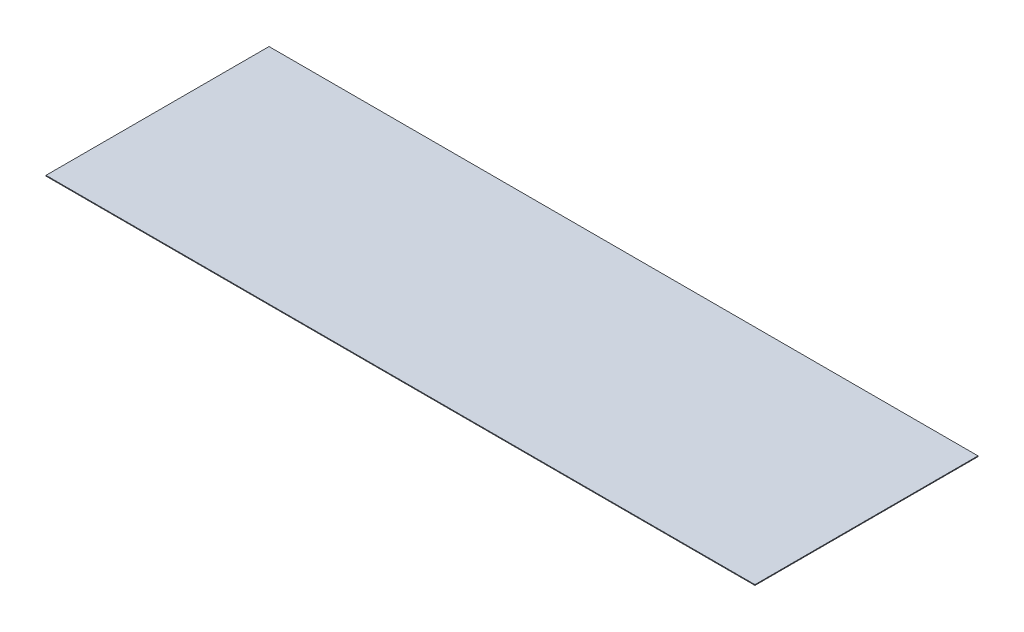
ISO-10303-21;
HEADER;
FILE_DESCRIPTION(('STEP AP214'),'2;1');
FILE_NAME('part.step','',(''),(''),'','','');
FILE_SCHEMA(('AUTOMOTIVE_DESIGN { 1 0 10303 214 1 1 1 1 }'));
ENDSEC;
DATA;
#1=APPLICATION_CONTEXT('core data for automotive mechanical design processes');
#2=APPLICATION_PROTOCOL_DEFINITION('international standard','automotive_design',2000,#1);
#3=PRODUCT_CONTEXT('',#1,'mechanical');
#4=PRODUCT('Part','Part','',(#3));
#5=PRODUCT_RELATED_PRODUCT_CATEGORY('part','',(#4));
#6=PRODUCT_DEFINITION_FORMATION('','',#4);
#7=PRODUCT_DEFINITION_CONTEXT('part definition',#1,'design');
#8=PRODUCT_DEFINITION('design','',#6,#7);
#9=PRODUCT_DEFINITION_SHAPE('','',#8);
#10=(LENGTH_UNIT() NAMED_UNIT(*) SI_UNIT(.MILLI.,.METRE.));
#11=(NAMED_UNIT(*) PLANE_ANGLE_UNIT() SI_UNIT($,.RADIAN.));
#12=(NAMED_UNIT(*) SI_UNIT($,.STERADIAN.) SOLID_ANGLE_UNIT());
#13=UNCERTAINTY_MEASURE_WITH_UNIT(LENGTH_MEASURE(1.E-05),#10,'distance_accuracy_value','');
#14=(GEOMETRIC_REPRESENTATION_CONTEXT(3) GLOBAL_UNCERTAINTY_ASSIGNED_CONTEXT((#13)) GLOBAL_UNIT_ASSIGNED_CONTEXT((#10,
#11,#12)) REPRESENTATION_CONTEXT('',''));
#15=CARTESIAN_POINT('',(0.,0.,0.));
#16=DIRECTION('',(0.,0.,1.));
#17=DIRECTION('',(1.,0.,0.));
#18=AXIS2_PLACEMENT_3D('',#15,#16,#17);
#19=CARTESIAN_POINT('',(960.,0.,302.));
#20=DIRECTION('',(1.,0.,0.));
#21=DIRECTION('',(0.,0.,-1.));
#22=AXIS2_PLACEMENT_3D('',#19,#20,#21);
#23=PLANE('',#22);
#24=DIRECTION('',(0.,1.,0.));
#25=VECTOR('',#24,1.);
#26=CARTESIAN_POINT('',(960.,0.,302.));
#27=LINE('',#26,#25);
#28=CARTESIAN_POINT('',(960.,0.,302.));
#29=VERTEX_POINT('',#28);
#30=CARTESIAN_POINT('',(960.,2.,302.));
#31=VERTEX_POINT('',#30);
#32=EDGE_CURVE('E11',#29,#31,#27,.T.);
#33=ORIENTED_EDGE('',*,*,#32,.F.);
#34=DIRECTION('',(0.,0.,-1.));
#35=VECTOR('',#34,1.);
#36=CARTESIAN_POINT('',(960.,0.,302.));
#37=LINE('',#36,#35);
#38=CARTESIAN_POINT('',(960.,0.,-302.));
#39=VERTEX_POINT('',#38);
#40=EDGE_CURVE('E106',#29,#39,#37,.T.);
#41=ORIENTED_EDGE('',*,*,#40,.T.);
#42=DIRECTION('',(0.,1.,0.));
#43=VECTOR('',#42,1.);
#44=CARTESIAN_POINT('',(960.,0.,-302.));
#45=LINE('',#44,#43);
#46=CARTESIAN_POINT('',(960.,2.,-302.));
#47=VERTEX_POINT('',#46);
#48=EDGE_CURVE('E58',#39,#47,#45,.T.);
#49=ORIENTED_EDGE('',*,*,#48,.T.);
#50=DIRECTION('',(0.,0.,1.));
#51=VECTOR('',#50,1.);
#52=CARTESIAN_POINT('',(960.,2.,0.));
#53=LINE('',#52,#51);
#54=EDGE_CURVE('E119',#31,#47,#53,.F.);
#55=ORIENTED_EDGE('',*,*,#54,.F.);
#56=EDGE_LOOP('',(#33,#41,#49,#55));
#57=FACE_BOUND('',#56,.T.);
#58=ADVANCED_FACE('F47',(#57),#23,.T.);
#59=CARTESIAN_POINT('',(960.,0.,-302.));
#60=DIRECTION('',(0.,0.,-1.));
#61=DIRECTION('',(-1.,0.,0.));
#62=AXIS2_PLACEMENT_3D('',#59,#60,#61);
#63=PLANE('',#62);
#64=ORIENTED_EDGE('',*,*,#48,.F.);
#65=DIRECTION('',(-1.,0.,0.));
#66=VECTOR('',#65,1.);
#67=CARTESIAN_POINT('',(960.,0.,-302.));
#68=LINE('',#67,#66);
#69=CARTESIAN_POINT('',(-960.000000000001,0.,-302.));
#70=VERTEX_POINT('',#69);
#71=EDGE_CURVE('E99',#39,#70,#68,.T.);
#72=ORIENTED_EDGE('',*,*,#71,.T.);
#73=DIRECTION('',(0.,1.,0.));
#74=VECTOR('',#73,1.);
#75=CARTESIAN_POINT('',(-960.000000000001,0.,-302.));
#76=LINE('',#75,#74);
#77=CARTESIAN_POINT('',(-960.000000000001,2.,-302.));
#78=VERTEX_POINT('',#77);
#79=EDGE_CURVE('E66',#70,#78,#76,.T.);
#80=ORIENTED_EDGE('',*,*,#79,.T.);
#81=DIRECTION('',(1.,0.,0.));
#82=VECTOR('',#81,1.);
#83=CARTESIAN_POINT('',(0.,2.,-302.));
#84=LINE('',#83,#82);
#85=EDGE_CURVE('E123',#47,#78,#84,.F.);
#86=ORIENTED_EDGE('',*,*,#85,.F.);
#87=EDGE_LOOP('',(#64,#72,#80,#86));
#88=FACE_BOUND('',#87,.T.);
#89=ADVANCED_FACE('F104',(#88),#63,.T.);
#90=CARTESIAN_POINT('',(-960.000000000001,0.,302.));
#91=DIRECTION('',(-1.,0.,0.));
#92=DIRECTION('',(0.,0.,1.));
#93=AXIS2_PLACEMENT_3D('',#90,#91,#92);
#94=PLANE('',#93);
#95=ORIENTED_EDGE('',*,*,#79,.F.);
#96=DIRECTION('',(0.,0.,1.));
#97=VECTOR('',#96,1.);
#98=CARTESIAN_POINT('',(-960.000000000001,0.,302.));
#99=LINE('',#98,#97);
#100=CARTESIAN_POINT('',(-960.000000000001,0.,302.));
#101=VERTEX_POINT('',#100);
#102=EDGE_CURVE('E88',#70,#101,#99,.T.);
#103=ORIENTED_EDGE('',*,*,#102,.T.);
#104=DIRECTION('',(0.,1.,0.));
#105=VECTOR('',#104,1.);
#106=CARTESIAN_POINT('',(-960.000000000001,0.,302.));
#107=LINE('',#106,#105);
#108=CARTESIAN_POINT('',(-960.000000000001,2.,302.));
#109=VERTEX_POINT('',#108);
#110=EDGE_CURVE('E51',#101,#109,#107,.T.);
#111=ORIENTED_EDGE('',*,*,#110,.T.);
#112=DIRECTION('',(0.,0.,1.));
#113=VECTOR('',#112,1.);
#114=CARTESIAN_POINT('',(-960.000000000001,2.,0.));
#115=LINE('',#114,#113);
#116=EDGE_CURVE('E90',#78,#109,#115,.T.);
#117=ORIENTED_EDGE('',*,*,#116,.F.);
#118=EDGE_LOOP('',(#95,#103,#111,#117));
#119=FACE_BOUND('',#118,.T.);
#120=ADVANCED_FACE('F87',(#119),#94,.T.);
#121=CARTESIAN_POINT('',(960.,0.,302.));
#122=DIRECTION('',(0.,0.,1.));
#123=DIRECTION('',(1.,0.,0.));
#124=AXIS2_PLACEMENT_3D('',#121,#122,#123);
#125=PLANE('',#124);
#126=DIRECTION('',(1.,0.,0.));
#127=VECTOR('',#126,1.);
#128=CARTESIAN_POINT('',(960.,0.,302.));
#129=LINE('',#128,#127);
#130=EDGE_CURVE('E101',#101,#29,#129,.T.);
#131=ORIENTED_EDGE('',*,*,#130,.T.);
#132=ORIENTED_EDGE('',*,*,#32,.T.);
#133=DIRECTION('',(1.,0.,0.));
#134=VECTOR('',#133,1.);
#135=CARTESIAN_POINT('',(0.,2.,302.));
#136=LINE('',#135,#134);
#137=EDGE_CURVE('E110',#109,#31,#136,.T.);
#138=ORIENTED_EDGE('',*,*,#137,.F.);
#139=ORIENTED_EDGE('',*,*,#110,.F.);
#140=EDGE_LOOP('',(#131,#132,#138,#139));
#141=FACE_BOUND('',#140,.T.);
#142=ADVANCED_FACE('F49',(#141),#125,.T.);
#143=CARTESIAN_POINT('',(0.,2.,0.));
#144=DIRECTION('',(0.,1.,0.));
#145=DIRECTION('',(0.,0.,1.));
#146=AXIS2_PLACEMENT_3D('',#143,#144,#145);
#147=PLANE('',#146);
#148=ORIENTED_EDGE('',*,*,#116,.T.);
#149=ORIENTED_EDGE('',*,*,#137,.T.);
#150=ORIENTED_EDGE('',*,*,#54,.T.);
#151=ORIENTED_EDGE('',*,*,#85,.T.);
#152=EDGE_LOOP('',(#148,#149,#150,#151));
#153=FACE_BOUND('',#152,.T.);
#154=ADVANCED_FACE('F122',(#153),#147,.T.);
#155=CARTESIAN_POINT('',(0.,0.,0.));
#156=DIRECTION('',(0.,1.,0.));
#157=DIRECTION('',(0.,0.,1.));
#158=AXIS2_PLACEMENT_3D('',#155,#156,#157);
#159=PLANE('',#158);
#160=ORIENTED_EDGE('',*,*,#102,.F.);
#161=ORIENTED_EDGE('',*,*,#71,.F.);
#162=ORIENTED_EDGE('',*,*,#40,.F.);
#163=ORIENTED_EDGE('',*,*,#130,.F.);
#164=EDGE_LOOP('',(#160,#161,#162,#163));
#165=FACE_BOUND('',#164,.T.);
#166=ADVANCED_FACE('F97',(#165),#159,.F.);
#167=CLOSED_SHELL('',(#58,#89,#120,#142,#154,#166));
#168=MANIFOLD_SOLID_BREP('B2',#167);
#169=ADVANCED_BREP_SHAPE_REPRESENTATION('',(#18,#168),#14);
#170=SHAPE_DEFINITION_REPRESENTATION(#9,#169);
ENDSEC;
END-ISO-10303-21;
